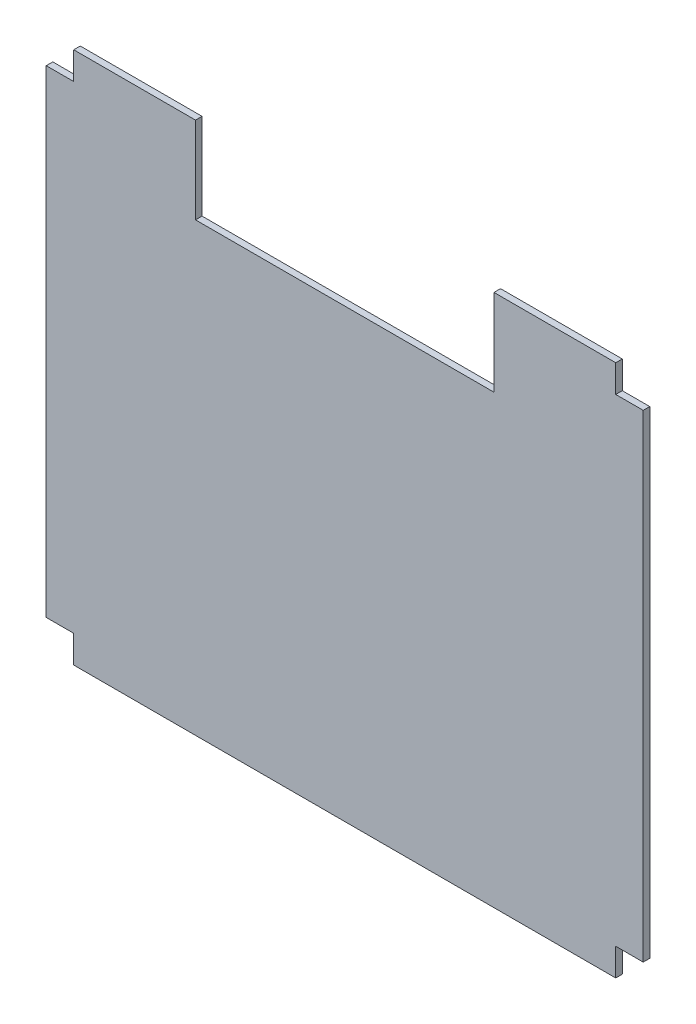
ISO-10303-21;
HEADER;
FILE_DESCRIPTION(('STEP AP214'),'2;1');
FILE_NAME('part.step','',(''),(''),'','','');
FILE_SCHEMA(('AUTOMOTIVE_DESIGN { 1 0 10303 214 1 1 1 1 }'));
ENDSEC;
DATA;
#1=APPLICATION_CONTEXT('core data for automotive mechanical design processes');
#2=APPLICATION_PROTOCOL_DEFINITION('international standard','automotive_design',2000,#1);
#3=PRODUCT_CONTEXT('',#1,'mechanical');
#4=PRODUCT('Part','Part','',(#3));
#5=PRODUCT_RELATED_PRODUCT_CATEGORY('part','',(#4));
#6=PRODUCT_DEFINITION_FORMATION('','',#4);
#7=PRODUCT_DEFINITION_CONTEXT('part definition',#1,'design');
#8=PRODUCT_DEFINITION('design','',#6,#7);
#9=PRODUCT_DEFINITION_SHAPE('','',#8);
#10=(LENGTH_UNIT() NAMED_UNIT(*) SI_UNIT(.MILLI.,.METRE.));
#11=(NAMED_UNIT(*) PLANE_ANGLE_UNIT() SI_UNIT($,.RADIAN.));
#12=(NAMED_UNIT(*) SI_UNIT($,.STERADIAN.) SOLID_ANGLE_UNIT());
#13=UNCERTAINTY_MEASURE_WITH_UNIT(LENGTH_MEASURE(1.E-05),#10,'distance_accuracy_value','');
#14=(GEOMETRIC_REPRESENTATION_CONTEXT(3) GLOBAL_UNCERTAINTY_ASSIGNED_CONTEXT((#13)) GLOBAL_UNIT_ASSIGNED_CONTEXT((#10,
#11,#12)) REPRESENTATION_CONTEXT('',''));
#15=CARTESIAN_POINT('',(0.,0.,0.));
#16=DIRECTION('',(0.,0.,1.));
#17=DIRECTION('',(1.,0.,0.));
#18=AXIS2_PLACEMENT_3D('',#15,#16,#17);
#19=CARTESIAN_POINT('',(207.,0.,5.));
#20=DIRECTION('',(1.,0.,0.));
#21=DIRECTION('',(0.,0.,-1.));
#22=AXIS2_PLACEMENT_3D('',#19,#20,#21);
#23=PLANE('',#22);
#24=DIRECTION('',(0.,-1.,0.));
#25=VECTOR('',#24,1.);
#26=CARTESIAN_POINT('',(207.,0.,0.));
#27=LINE('',#26,#25);
#28=CARTESIAN_POINT('',(207.,-182.5,0.));
#29=VERTEX_POINT('',#28);
#30=CARTESIAN_POINT('',(207.,-203.5,0.));
#31=VERTEX_POINT('',#30);
#32=EDGE_CURVE('E184',#29,#31,#27,.T.);
#33=ORIENTED_EDGE('',*,*,#32,.F.);
#34=DIRECTION('',(0.,0.,-1.));
#35=VECTOR('',#34,1.);
#36=CARTESIAN_POINT('',(207.,-182.5,5.));
#37=LINE('',#36,#35);
#38=CARTESIAN_POINT('',(207.,-182.5,5.));
#39=VERTEX_POINT('',#38);
#40=EDGE_CURVE('E11',#39,#29,#37,.T.);
#41=ORIENTED_EDGE('',*,*,#40,.F.);
#42=DIRECTION('',(0.,-1.,0.));
#43=VECTOR('',#42,1.);
#44=CARTESIAN_POINT('',(207.,0.,5.));
#45=LINE('',#44,#43);
#46=CARTESIAN_POINT('',(207.,-203.5,5.));
#47=VERTEX_POINT('',#46);
#48=EDGE_CURVE('E223',#39,#47,#45,.T.);
#49=ORIENTED_EDGE('',*,*,#48,.T.);
#50=DIRECTION('',(0.,0.,-1.));
#51=VECTOR('',#50,1.);
#52=CARTESIAN_POINT('',(207.,-203.5,5.));
#53=LINE('',#52,#51);
#54=EDGE_CURVE('E116',#47,#31,#53,.T.);
#55=ORIENTED_EDGE('',*,*,#54,.T.);
#56=EDGE_LOOP('',(#33,#41,#49,#55));
#57=FACE_BOUND('',#56,.T.);
#58=ADVANCED_FACE('F42',(#57),#23,.T.);
#59=CARTESIAN_POINT('',(0.,-182.5,5.));
#60=DIRECTION('',(0.,1.,0.));
#61=DIRECTION('',(0.,0.,1.));
#62=AXIS2_PLACEMENT_3D('',#59,#60,#61);
#63=PLANE('',#62);
#64=DIRECTION('',(1.,0.,0.));
#65=VECTOR('',#64,1.);
#66=CARTESIAN_POINT('',(0.,-182.5,0.));
#67=LINE('',#66,#65);
#68=CARTESIAN_POINT('',(228.,-182.5,0.));
#69=VERTEX_POINT('',#68);
#70=EDGE_CURVE('E187',#29,#69,#67,.T.);
#71=ORIENTED_EDGE('',*,*,#70,.T.);
#72=DIRECTION('',(0.,0.,-1.));
#73=VECTOR('',#72,1.);
#74=CARTESIAN_POINT('',(228.,-182.5,5.));
#75=LINE('',#74,#73);
#76=CARTESIAN_POINT('',(228.,-182.5,5.));
#77=VERTEX_POINT('',#76);
#78=EDGE_CURVE('E50',#77,#69,#75,.T.);
#79=ORIENTED_EDGE('',*,*,#78,.F.);
#80=DIRECTION('',(1.,0.,0.));
#81=VECTOR('',#80,1.);
#82=CARTESIAN_POINT('',(0.,-182.5,5.));
#83=LINE('',#82,#81);
#84=EDGE_CURVE('E272',#39,#77,#83,.T.);
#85=ORIENTED_EDGE('',*,*,#84,.F.);
#86=ORIENTED_EDGE('',*,*,#40,.T.);
#87=EDGE_LOOP('',(#71,#79,#85,#86));
#88=FACE_BOUND('',#87,.T.);
#89=ADVANCED_FACE('F303',(#88),#63,.F.);
#90=CARTESIAN_POINT('',(228.,0.,5.));
#91=DIRECTION('',(-1.,0.,0.));
#92=DIRECTION('',(0.,0.,1.));
#93=AXIS2_PLACEMENT_3D('',#90,#91,#92);
#94=PLANE('',#93);
#95=DIRECTION('',(0.,1.,0.));
#96=VECTOR('',#95,1.);
#97=CARTESIAN_POINT('',(228.,0.,0.));
#98=LINE('',#97,#96);
#99=CARTESIAN_POINT('',(228.,182.5,0.));
#100=VERTEX_POINT('',#99);
#101=EDGE_CURVE('E189',#69,#100,#98,.T.);
#102=ORIENTED_EDGE('',*,*,#101,.T.);
#103=DIRECTION('',(0.,0.,-1.));
#104=VECTOR('',#103,1.);
#105=CARTESIAN_POINT('',(228.,182.5,5.));
#106=LINE('',#105,#104);
#107=CARTESIAN_POINT('',(228.,182.5,5.));
#108=VERTEX_POINT('',#107);
#109=EDGE_CURVE('E246',#108,#100,#106,.T.);
#110=ORIENTED_EDGE('',*,*,#109,.F.);
#111=DIRECTION('',(0.,1.,0.));
#112=VECTOR('',#111,1.);
#113=CARTESIAN_POINT('',(228.,0.,5.));
#114=LINE('',#113,#112);
#115=EDGE_CURVE('E254',#77,#108,#114,.T.);
#116=ORIENTED_EDGE('',*,*,#115,.F.);
#117=ORIENTED_EDGE('',*,*,#78,.T.);
#118=EDGE_LOOP('',(#102,#110,#116,#117));
#119=FACE_BOUND('',#118,.T.);
#120=ADVANCED_FACE('F252',(#119),#94,.F.);
#121=CARTESIAN_POINT('',(0.,182.5,5.));
#122=DIRECTION('',(0.,1.,0.));
#123=DIRECTION('',(0.,0.,1.));
#124=AXIS2_PLACEMENT_3D('',#121,#122,#123);
#125=PLANE('',#124);
#126=DIRECTION('',(1.,0.,0.));
#127=VECTOR('',#126,1.);
#128=CARTESIAN_POINT('',(0.,182.5,0.));
#129=LINE('',#128,#127);
#130=CARTESIAN_POINT('',(207.,182.5,0.));
#131=VERTEX_POINT('',#130);
#132=EDGE_CURVE('E192',#131,#100,#129,.T.);
#133=ORIENTED_EDGE('',*,*,#132,.F.);
#134=DIRECTION('',(0.,0.,-1.));
#135=VECTOR('',#134,1.);
#136=CARTESIAN_POINT('',(207.,182.5,5.));
#137=LINE('',#136,#135);
#138=CARTESIAN_POINT('',(207.,182.5,5.));
#139=VERTEX_POINT('',#138);
#140=EDGE_CURVE('E244',#139,#131,#137,.T.);
#141=ORIENTED_EDGE('',*,*,#140,.F.);
#142=DIRECTION('',(1.,0.,0.));
#143=VECTOR('',#142,1.);
#144=CARTESIAN_POINT('',(0.,182.5,5.));
#145=LINE('',#144,#143);
#146=EDGE_CURVE('E265',#139,#108,#145,.T.);
#147=ORIENTED_EDGE('',*,*,#146,.T.);
#148=ORIENTED_EDGE('',*,*,#109,.T.);
#149=EDGE_LOOP('',(#133,#141,#147,#148));
#150=FACE_BOUND('',#149,.T.);
#151=ADVANCED_FACE('F262',(#150),#125,.T.);
#152=CARTESIAN_POINT('',(207.,2.73590673925486E-13,5.));
#153=DIRECTION('',(1.,0.,0.));
#154=DIRECTION('',(0.,1.,0.));
#155=AXIS2_PLACEMENT_3D('',#152,#153,#154);
#156=PLANE('',#155);
#157=DIRECTION('',(0.,-1.,0.));
#158=VECTOR('',#157,1.);
#159=CARTESIAN_POINT('',(207.,2.73590673925486E-13,0.));
#160=LINE('',#159,#158);
#161=CARTESIAN_POINT('',(207.,203.5,0.));
#162=VERTEX_POINT('',#161);
#163=EDGE_CURVE('E195',#162,#131,#160,.T.);
#164=ORIENTED_EDGE('',*,*,#163,.F.);
#165=DIRECTION('',(0.,0.,-1.));
#166=VECTOR('',#165,1.);
#167=CARTESIAN_POINT('',(207.,203.5,5.));
#168=LINE('',#167,#166);
#169=CARTESIAN_POINT('',(207.,203.5,5.));
#170=VERTEX_POINT('',#169);
#171=EDGE_CURVE('E242',#170,#162,#168,.T.);
#172=ORIENTED_EDGE('',*,*,#171,.F.);
#173=DIRECTION('',(0.,-1.,0.));
#174=VECTOR('',#173,1.);
#175=CARTESIAN_POINT('',(207.,2.73590673925486E-13,5.));
#176=LINE('',#175,#174);
#177=EDGE_CURVE('E268',#170,#139,#176,.T.);
#178=ORIENTED_EDGE('',*,*,#177,.T.);
#179=ORIENTED_EDGE('',*,*,#140,.T.);
#180=EDGE_LOOP('',(#164,#172,#178,#179));
#181=FACE_BOUND('',#180,.T.);
#182=ADVANCED_FACE('F313',(#181),#156,.T.);
#183=CARTESIAN_POINT('',(0.,203.5,5.));
#184=DIRECTION('',(0.,1.,0.));
#185=DIRECTION('',(0.,0.,1.));
#186=AXIS2_PLACEMENT_3D('',#183,#184,#185);
#187=PLANE('',#186);
#188=DIRECTION('',(1.,0.,0.));
#189=VECTOR('',#188,1.);
#190=CARTESIAN_POINT('',(0.,203.5,0.));
#191=LINE('',#190,#189);
#192=CARTESIAN_POINT('',(114.,203.5,0.));
#193=VERTEX_POINT('',#192);
#194=EDGE_CURVE('E198',#193,#162,#191,.T.);
#195=ORIENTED_EDGE('',*,*,#194,.F.);
#196=DIRECTION('',(0.,0.,-1.));
#197=VECTOR('',#196,1.);
#198=CARTESIAN_POINT('',(114.,203.5,5.));
#199=LINE('',#198,#197);
#200=CARTESIAN_POINT('',(114.,203.5,5.));
#201=VERTEX_POINT('',#200);
#202=EDGE_CURVE('E240',#201,#193,#199,.T.);
#203=ORIENTED_EDGE('',*,*,#202,.F.);
#204=DIRECTION('',(1.,0.,0.));
#205=VECTOR('',#204,1.);
#206=CARTESIAN_POINT('',(0.,203.5,5.));
#207=LINE('',#206,#205);
#208=EDGE_CURVE('E270',#201,#170,#207,.T.);
#209=ORIENTED_EDGE('',*,*,#208,.T.);
#210=ORIENTED_EDGE('',*,*,#171,.T.);
#211=EDGE_LOOP('',(#195,#203,#209,#210));
#212=FACE_BOUND('',#211,.T.);
#213=ADVANCED_FACE('F316',(#212),#187,.T.);
#214=CARTESIAN_POINT('',(114.000000000001,4.31473039115689E-13,5.));
#215=DIRECTION('',(-1.,0.,0.));
#216=DIRECTION('',(0.,-1.,0.));
#217=AXIS2_PLACEMENT_3D('',#214,#215,#216);
#218=PLANE('',#217);
#219=DIRECTION('',(0.,1.,0.));
#220=VECTOR('',#219,1.);
#221=CARTESIAN_POINT('',(114.000000000001,4.31473039115689E-13,0.));
#222=LINE('',#221,#220);
#223=CARTESIAN_POINT('',(114.,137.5,0.));
#224=VERTEX_POINT('',#223);
#225=EDGE_CURVE('E201',#224,#193,#222,.T.);
#226=ORIENTED_EDGE('',*,*,#225,.F.);
#227=DIRECTION('',(0.,0.,-1.));
#228=VECTOR('',#227,1.);
#229=CARTESIAN_POINT('',(114.,137.5,5.));
#230=LINE('',#229,#228);
#231=CARTESIAN_POINT('',(114.,137.5,5.));
#232=VERTEX_POINT('',#231);
#233=EDGE_CURVE('E238',#232,#224,#230,.T.);
#234=ORIENTED_EDGE('',*,*,#233,.F.);
#235=DIRECTION('',(0.,1.,0.));
#236=VECTOR('',#235,1.);
#237=CARTESIAN_POINT('',(114.000000000001,4.31473039115689E-13,5.));
#238=LINE('',#237,#236);
#239=EDGE_CURVE('E278',#232,#201,#238,.T.);
#240=ORIENTED_EDGE('',*,*,#239,.T.);
#241=ORIENTED_EDGE('',*,*,#202,.T.);
#242=EDGE_LOOP('',(#226,#234,#240,#241));
#243=FACE_BOUND('',#242,.T.);
#244=ADVANCED_FACE('F318',(#243),#218,.T.);
#245=CARTESIAN_POINT('',(0.,137.5,5.));
#246=DIRECTION('',(0.,1.,0.));
#247=DIRECTION('',(-1.,0.,0.));
#248=AXIS2_PLACEMENT_3D('',#245,#246,#247);
#249=PLANE('',#248);
#250=DIRECTION('',(1.,0.,0.));
#251=VECTOR('',#250,1.);
#252=CARTESIAN_POINT('',(0.,137.5,0.));
#253=LINE('',#252,#251);
#254=CARTESIAN_POINT('',(-114.,137.5,0.));
#255=VERTEX_POINT('',#254);
#256=EDGE_CURVE('E205',#255,#224,#253,.T.);
#257=ORIENTED_EDGE('',*,*,#256,.F.);
#258=DIRECTION('',(0.,0.,-1.));
#259=VECTOR('',#258,1.);
#260=CARTESIAN_POINT('',(-114.,137.5,5.));
#261=LINE('',#260,#259);
#262=CARTESIAN_POINT('',(-114.,137.5,5.));
#263=VERTEX_POINT('',#262);
#264=EDGE_CURVE('E236',#263,#255,#261,.T.);
#265=ORIENTED_EDGE('',*,*,#264,.F.);
#266=DIRECTION('',(1.,0.,0.));
#267=VECTOR('',#266,1.);
#268=CARTESIAN_POINT('',(0.,137.5,5.));
#269=LINE('',#268,#267);
#270=EDGE_CURVE('E282',#263,#232,#269,.T.);
#271=ORIENTED_EDGE('',*,*,#270,.T.);
#272=ORIENTED_EDGE('',*,*,#233,.T.);
#273=EDGE_LOOP('',(#257,#265,#271,#272));
#274=FACE_BOUND('',#273,.T.);
#275=ADVANCED_FACE('F321',(#274),#249,.T.);
#276=CARTESIAN_POINT('',(-114.000000000001,2.63677968348476E-13,5.));
#277=DIRECTION('',(-1.,0.,0.));
#278=DIRECTION('',(0.,-1.,0.));
#279=AXIS2_PLACEMENT_3D('',#276,#277,#278);
#280=PLANE('',#279);
#281=DIRECTION('',(0.,1.,0.));
#282=VECTOR('',#281,1.);
#283=CARTESIAN_POINT('',(-114.000000000001,2.63677968348476E-13,0.));
#284=LINE('',#283,#282);
#285=CARTESIAN_POINT('',(-114.,203.5,0.));
#286=VERTEX_POINT('',#285);
#287=EDGE_CURVE('E208',#255,#286,#284,.T.);
#288=ORIENTED_EDGE('',*,*,#287,.T.);
#289=DIRECTION('',(0.,0.,-1.));
#290=VECTOR('',#289,1.);
#291=CARTESIAN_POINT('',(-114.,203.5,5.));
#292=LINE('',#291,#290);
#293=CARTESIAN_POINT('',(-114.,203.5,5.));
#294=VERTEX_POINT('',#293);
#295=EDGE_CURVE('E234',#294,#286,#292,.T.);
#296=ORIENTED_EDGE('',*,*,#295,.F.);
#297=DIRECTION('',(0.,1.,0.));
#298=VECTOR('',#297,1.);
#299=CARTESIAN_POINT('',(-114.000000000001,2.63677968348476E-13,5.));
#300=LINE('',#299,#298);
#301=EDGE_CURVE('E285',#263,#294,#300,.T.);
#302=ORIENTED_EDGE('',*,*,#301,.F.);
#303=ORIENTED_EDGE('',*,*,#264,.T.);
#304=EDGE_LOOP('',(#288,#296,#302,#303));
#305=FACE_BOUND('',#304,.T.);
#306=ADVANCED_FACE('F325',(#305),#280,.F.);
#307=CARTESIAN_POINT('',(-207.,203.5,0.));
#308=VERTEX_POINT('',#307);
#309=EDGE_CURVE('E202',#308,#286,#191,.T.);
#310=ORIENTED_EDGE('',*,*,#309,.F.);
#311=DIRECTION('',(0.,0.,-1.));
#312=VECTOR('',#311,1.);
#313=CARTESIAN_POINT('',(-207.,203.5,5.));
#314=LINE('',#313,#312);
#315=CARTESIAN_POINT('',(-207.,203.5,5.));
#316=VERTEX_POINT('',#315);
#317=EDGE_CURVE('E232',#316,#308,#314,.T.);
#318=ORIENTED_EDGE('',*,*,#317,.F.);
#319=EDGE_CURVE('E279',#316,#294,#207,.T.);
#320=ORIENTED_EDGE('',*,*,#319,.T.);
#321=ORIENTED_EDGE('',*,*,#295,.T.);
#322=EDGE_LOOP('',(#310,#318,#320,#321));
#323=FACE_BOUND('',#322,.T.);
#324=ADVANCED_FACE('F329',(#323),#187,.T.);
#325=CARTESIAN_POINT('',(-207.,-2.73590673925485E-13,5.));
#326=DIRECTION('',(1.,0.,0.));
#327=DIRECTION('',(0.,1.,0.));
#328=AXIS2_PLACEMENT_3D('',#325,#326,#327);
#329=PLANE('',#328);
#330=DIRECTION('',(0.,-1.,0.));
#331=VECTOR('',#330,1.);
#332=CARTESIAN_POINT('',(-207.,-2.73590673925485E-13,0.));
#333=LINE('',#332,#331);
#334=CARTESIAN_POINT('',(-207.,182.5,0.));
#335=VERTEX_POINT('',#334);
#336=EDGE_CURVE('E211',#308,#335,#333,.T.);
#337=ORIENTED_EDGE('',*,*,#336,.T.);
#338=DIRECTION('',(0.,0.,-1.));
#339=VECTOR('',#338,1.);
#340=CARTESIAN_POINT('',(-207.,182.5,5.));
#341=LINE('',#340,#339);
#342=CARTESIAN_POINT('',(-207.,182.5,5.));
#343=VERTEX_POINT('',#342);
#344=EDGE_CURVE('E229',#343,#335,#341,.T.);
#345=ORIENTED_EDGE('',*,*,#344,.F.);
#346=DIRECTION('',(0.,-1.,0.));
#347=VECTOR('',#346,1.);
#348=CARTESIAN_POINT('',(-207.,-2.73590673925485E-13,5.));
#349=LINE('',#348,#347);
#350=EDGE_CURVE('E287',#316,#343,#349,.T.);
#351=ORIENTED_EDGE('',*,*,#350,.F.);
#352=ORIENTED_EDGE('',*,*,#317,.T.);
#353=EDGE_LOOP('',(#337,#345,#351,#352));
#354=FACE_BOUND('',#353,.T.);
#355=ADVANCED_FACE('F333',(#354),#329,.F.);
#356=CARTESIAN_POINT('',(0.,182.5,5.));
#357=DIRECTION('',(0.,-1.,0.));
#358=DIRECTION('',(0.,0.,-1.));
#359=AXIS2_PLACEMENT_3D('',#356,#357,#358);
#360=PLANE('',#359);
#361=DIRECTION('',(-1.,0.,0.));
#362=VECTOR('',#361,1.);
#363=CARTESIAN_POINT('',(0.,182.5,0.));
#364=LINE('',#363,#362);
#365=CARTESIAN_POINT('',(-228.,182.5,0.));
#366=VERTEX_POINT('',#365);
#367=EDGE_CURVE('E213',#335,#366,#364,.T.);
#368=ORIENTED_EDGE('',*,*,#367,.T.);
#369=DIRECTION('',(0.,0.,-1.));
#370=VECTOR('',#369,1.);
#371=CARTESIAN_POINT('',(-228.,182.5,5.));
#372=LINE('',#371,#370);
#373=CARTESIAN_POINT('',(-228.,182.5,5.));
#374=VERTEX_POINT('',#373);
#375=EDGE_CURVE('E227',#374,#366,#372,.T.);
#376=ORIENTED_EDGE('',*,*,#375,.F.);
#377=DIRECTION('',(-1.,0.,0.));
#378=VECTOR('',#377,1.);
#379=CARTESIAN_POINT('',(0.,182.5,5.));
#380=LINE('',#379,#378);
#381=EDGE_CURVE('E179',#343,#374,#380,.T.);
#382=ORIENTED_EDGE('',*,*,#381,.F.);
#383=ORIENTED_EDGE('',*,*,#344,.T.);
#384=EDGE_LOOP('',(#368,#376,#382,#383));
#385=FACE_BOUND('',#384,.T.);
#386=ADVANCED_FACE('F294',(#385),#360,.F.);
#387=CARTESIAN_POINT('',(-228.,0.,5.));
#388=DIRECTION('',(-1.,0.,0.));
#389=DIRECTION('',(0.,0.,1.));
#390=AXIS2_PLACEMENT_3D('',#387,#388,#389);
#391=PLANE('',#390);
#392=DIRECTION('',(0.,1.,0.));
#393=VECTOR('',#392,1.);
#394=CARTESIAN_POINT('',(-228.,0.,0.));
#395=LINE('',#394,#393);
#396=CARTESIAN_POINT('',(-228.,-182.5,0.));
#397=VERTEX_POINT('',#396);
#398=EDGE_CURVE('E216',#397,#366,#395,.T.);
#399=ORIENTED_EDGE('',*,*,#398,.F.);
#400=DIRECTION('',(0.,0.,-1.));
#401=VECTOR('',#400,1.);
#402=CARTESIAN_POINT('',(-228.,-182.5,5.));
#403=LINE('',#402,#401);
#404=CARTESIAN_POINT('',(-228.,-182.5,5.));
#405=VERTEX_POINT('',#404);
#406=EDGE_CURVE('E168',#405,#397,#403,.T.);
#407=ORIENTED_EDGE('',*,*,#406,.F.);
#408=DIRECTION('',(0.,1.,0.));
#409=VECTOR('',#408,1.);
#410=CARTESIAN_POINT('',(-228.,0.,5.));
#411=LINE('',#410,#409);
#412=EDGE_CURVE('E177',#405,#374,#411,.T.);
#413=ORIENTED_EDGE('',*,*,#412,.T.);
#414=ORIENTED_EDGE('',*,*,#375,.T.);
#415=EDGE_LOOP('',(#399,#407,#413,#414));
#416=FACE_BOUND('',#415,.T.);
#417=ADVANCED_FACE('F298',(#416),#391,.T.);
#418=CARTESIAN_POINT('',(0.,-182.5,5.));
#419=DIRECTION('',(0.,-1.,0.));
#420=DIRECTION('',(0.,0.,-1.));
#421=AXIS2_PLACEMENT_3D('',#418,#419,#420);
#422=PLANE('',#421);
#423=DIRECTION('',(-1.,0.,0.));
#424=VECTOR('',#423,1.);
#425=CARTESIAN_POINT('',(0.,-182.5,0.));
#426=LINE('',#425,#424);
#427=CARTESIAN_POINT('',(-207.,-182.5,0.));
#428=VERTEX_POINT('',#427);
#429=EDGE_CURVE('E167',#428,#397,#426,.T.);
#430=ORIENTED_EDGE('',*,*,#429,.F.);
#431=DIRECTION('',(0.,0.,-1.));
#432=VECTOR('',#431,1.);
#433=CARTESIAN_POINT('',(-207.,-182.5,5.));
#434=LINE('',#433,#432);
#435=CARTESIAN_POINT('',(-207.,-182.5,5.));
#436=VERTEX_POINT('',#435);
#437=EDGE_CURVE('E161',#436,#428,#434,.T.);
#438=ORIENTED_EDGE('',*,*,#437,.F.);
#439=DIRECTION('',(-1.,0.,0.));
#440=VECTOR('',#439,1.);
#441=CARTESIAN_POINT('',(0.,-182.5,5.));
#442=LINE('',#441,#440);
#443=EDGE_CURVE('E165',#436,#405,#442,.T.);
#444=ORIENTED_EDGE('',*,*,#443,.T.);
#445=ORIENTED_EDGE('',*,*,#406,.T.);
#446=EDGE_LOOP('',(#430,#438,#444,#445));
#447=FACE_BOUND('',#446,.T.);
#448=ADVANCED_FACE('F163',(#447),#422,.T.);
#449=CARTESIAN_POINT('',(-207.,0.,5.));
#450=DIRECTION('',(1.,0.,0.));
#451=DIRECTION('',(0.,0.,-1.));
#452=AXIS2_PLACEMENT_3D('',#449,#450,#451);
#453=PLANE('',#452);
#454=DIRECTION('',(0.,-1.,0.));
#455=VECTOR('',#454,1.);
#456=CARTESIAN_POINT('',(-207.,0.,0.));
#457=LINE('',#456,#455);
#458=CARTESIAN_POINT('',(-207.,-203.5,0.));
#459=VERTEX_POINT('',#458);
#460=EDGE_CURVE('E109',#428,#459,#457,.T.);
#461=ORIENTED_EDGE('',*,*,#460,.T.);
#462=DIRECTION('',(0.,0.,-1.));
#463=VECTOR('',#462,1.);
#464=CARTESIAN_POINT('',(-207.,-203.5,5.));
#465=LINE('',#464,#463);
#466=CARTESIAN_POINT('',(-207.,-203.5,5.));
#467=VERTEX_POINT('',#466);
#468=EDGE_CURVE('E169',#467,#459,#465,.T.);
#469=ORIENTED_EDGE('',*,*,#468,.F.);
#470=DIRECTION('',(0.,-1.,0.));
#471=VECTOR('',#470,1.);
#472=CARTESIAN_POINT('',(-207.,0.,5.));
#473=LINE('',#472,#471);
#474=EDGE_CURVE('E171',#436,#467,#473,.T.);
#475=ORIENTED_EDGE('',*,*,#474,.F.);
#476=ORIENTED_EDGE('',*,*,#437,.T.);
#477=EDGE_LOOP('',(#461,#469,#475,#476));
#478=FACE_BOUND('',#477,.T.);
#479=ADVANCED_FACE('F172',(#478),#453,.F.);
#480=CARTESIAN_POINT('',(0.,-203.5,5.));
#481=DIRECTION('',(0.,1.,0.));
#482=DIRECTION('',(0.,0.,1.));
#483=AXIS2_PLACEMENT_3D('',#480,#481,#482);
#484=PLANE('',#483);
#485=DIRECTION('',(1.,0.,0.));
#486=VECTOR('',#485,1.);
#487=CARTESIAN_POINT('',(0.,-203.5,0.));
#488=LINE('',#487,#486);
#489=EDGE_CURVE('E221',#459,#31,#488,.T.);
#490=ORIENTED_EDGE('',*,*,#489,.T.);
#491=ORIENTED_EDGE('',*,*,#54,.F.);
#492=DIRECTION('',(1.,0.,0.));
#493=VECTOR('',#492,1.);
#494=CARTESIAN_POINT('',(0.,-203.5,5.));
#495=LINE('',#494,#493);
#496=EDGE_CURVE('E58',#467,#47,#495,.T.);
#497=ORIENTED_EDGE('',*,*,#496,.F.);
#498=ORIENTED_EDGE('',*,*,#468,.T.);
#499=EDGE_LOOP('',(#490,#491,#497,#498));
#500=FACE_BOUND('',#499,.T.);
#501=ADVANCED_FACE('F301',(#500),#484,.F.);
#502=CARTESIAN_POINT('',(0.,0.,5.));
#503=DIRECTION('',(0.,0.,1.));
#504=DIRECTION('',(1.,0.,0.));
#505=AXIS2_PLACEMENT_3D('',#502,#503,#504);
#506=PLANE('',#505);
#507=ORIENTED_EDGE('',*,*,#48,.F.);
#508=ORIENTED_EDGE('',*,*,#84,.T.);
#509=ORIENTED_EDGE('',*,*,#115,.T.);
#510=ORIENTED_EDGE('',*,*,#146,.F.);
#511=ORIENTED_EDGE('',*,*,#177,.F.);
#512=ORIENTED_EDGE('',*,*,#208,.F.);
#513=ORIENTED_EDGE('',*,*,#239,.F.);
#514=ORIENTED_EDGE('',*,*,#270,.F.);
#515=ORIENTED_EDGE('',*,*,#301,.T.);
#516=ORIENTED_EDGE('',*,*,#319,.F.);
#517=ORIENTED_EDGE('',*,*,#350,.T.);
#518=ORIENTED_EDGE('',*,*,#381,.T.);
#519=ORIENTED_EDGE('',*,*,#412,.F.);
#520=ORIENTED_EDGE('',*,*,#443,.F.);
#521=ORIENTED_EDGE('',*,*,#474,.T.);
#522=ORIENTED_EDGE('',*,*,#496,.T.);
#523=EDGE_LOOP('',(#507,#508,#509,#510,#511,#512,#513,#514,#515,#516,#517,#518,#519,#520,#521,#522));
#524=FACE_BOUND('',#523,.T.);
#525=ADVANCED_FACE('F175',(#524),#506,.T.);
#526=CARTESIAN_POINT('',(0.,0.,0.));
#527=DIRECTION('',(0.,0.,1.));
#528=DIRECTION('',(1.,0.,0.));
#529=AXIS2_PLACEMENT_3D('',#526,#527,#528);
#530=PLANE('',#529);
#531=ORIENTED_EDGE('',*,*,#32,.T.);
#532=ORIENTED_EDGE('',*,*,#489,.F.);
#533=ORIENTED_EDGE('',*,*,#460,.F.);
#534=ORIENTED_EDGE('',*,*,#429,.T.);
#535=ORIENTED_EDGE('',*,*,#398,.T.);
#536=ORIENTED_EDGE('',*,*,#367,.F.);
#537=ORIENTED_EDGE('',*,*,#336,.F.);
#538=ORIENTED_EDGE('',*,*,#309,.T.);
#539=ORIENTED_EDGE('',*,*,#287,.F.);
#540=ORIENTED_EDGE('',*,*,#256,.T.);
#541=ORIENTED_EDGE('',*,*,#225,.T.);
#542=ORIENTED_EDGE('',*,*,#194,.T.);
#543=ORIENTED_EDGE('',*,*,#163,.T.);
#544=ORIENTED_EDGE('',*,*,#132,.T.);
#545=ORIENTED_EDGE('',*,*,#101,.F.);
#546=ORIENTED_EDGE('',*,*,#70,.F.);
#547=EDGE_LOOP('',(#531,#532,#533,#534,#535,#536,#537,#538,#539,#540,#541,#542,#543,#544,#545,#546));
#548=FACE_BOUND('',#547,.T.);
#549=ADVANCED_FACE('F258',(#548),#530,.F.);
#550=CLOSED_SHELL('',(#58,#89,#120,#151,#182,#213,#244,#275,#306,#324,#355,#386,#417,#448,#479,
#501,#525,#549));
#551=MANIFOLD_SOLID_BREP('B2',#550);
#552=ADVANCED_BREP_SHAPE_REPRESENTATION('',(#18,#551),#14);
#553=SHAPE_DEFINITION_REPRESENTATION(#9,#552);
ENDSEC;
END-ISO-10303-21;
